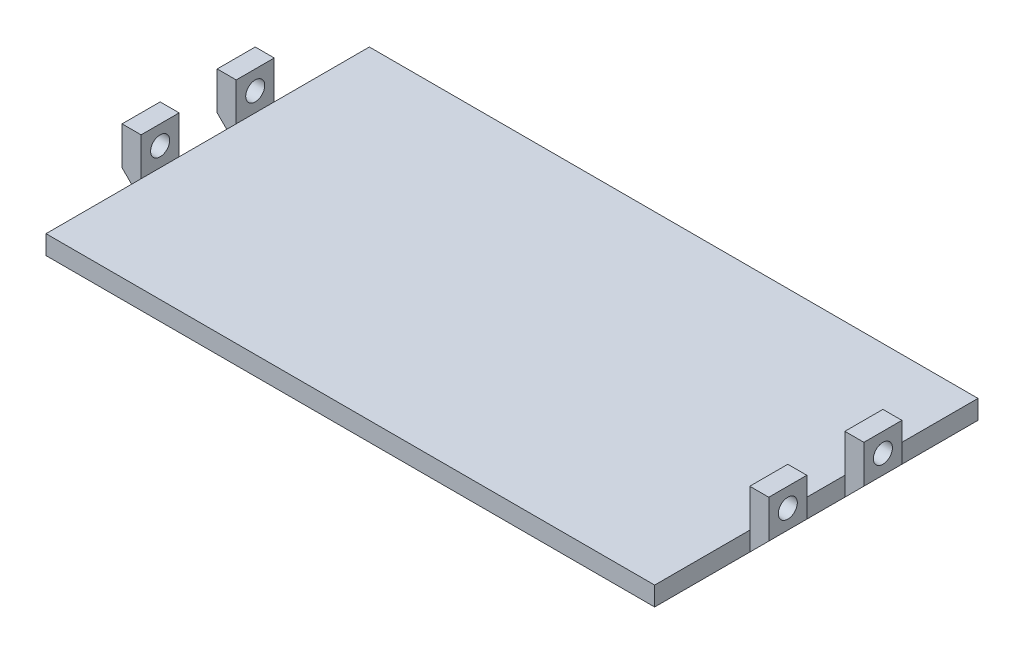
ISO-10303-21;
HEADER;
FILE_DESCRIPTION(('STEP AP214'),'2;1');
FILE_NAME('part.step','',(''),(''),'','','');
FILE_SCHEMA(('AUTOMOTIVE_DESIGN { 1 0 10303 214 1 1 1 1 }'));
ENDSEC;
DATA;
#1=APPLICATION_CONTEXT('core data for automotive mechanical design processes');
#2=APPLICATION_PROTOCOL_DEFINITION('international standard','automotive_design',2000,#1);
#3=PRODUCT_CONTEXT('',#1,'mechanical');
#4=PRODUCT('Part','Part','',(#3));
#5=PRODUCT_RELATED_PRODUCT_CATEGORY('part','',(#4));
#6=PRODUCT_DEFINITION_FORMATION('','',#4);
#7=PRODUCT_DEFINITION_CONTEXT('part definition',#1,'design');
#8=PRODUCT_DEFINITION('design','',#6,#7);
#9=PRODUCT_DEFINITION_SHAPE('','',#8);
#10=(LENGTH_UNIT() NAMED_UNIT(*) SI_UNIT(.MILLI.,.METRE.));
#11=(NAMED_UNIT(*) PLANE_ANGLE_UNIT() SI_UNIT($,.RADIAN.));
#12=(NAMED_UNIT(*) SI_UNIT($,.STERADIAN.) SOLID_ANGLE_UNIT());
#13=UNCERTAINTY_MEASURE_WITH_UNIT(LENGTH_MEASURE(1.E-05),#10,'distance_accuracy_value','');
#14=(GEOMETRIC_REPRESENTATION_CONTEXT(3) GLOBAL_UNCERTAINTY_ASSIGNED_CONTEXT((#13)) GLOBAL_UNIT_ASSIGNED_CONTEXT((#10,
#11,#12)) REPRESENTATION_CONTEXT('',''));
#15=CARTESIAN_POINT('',(0.,0.,0.));
#16=DIRECTION('',(0.,0.,1.));
#17=DIRECTION('',(1.,0.,0.));
#18=AXIS2_PLACEMENT_3D('',#15,#16,#17);
#19=CARTESIAN_POINT('',(85.,5.,-42.5));
#20=DIRECTION('',(-1.,0.,0.));
#21=DIRECTION('',(0.,0.,1.));
#22=AXIS2_PLACEMENT_3D('',#19,#20,#21);
#23=PLANE('',#22);
#24=CARTESIAN_POINT('',(85.,10.,-12.5));
#25=DIRECTION('',(-1.,0.,0.));
#26=DIRECTION('',(0.,0.,1.));
#27=AXIS2_PLACEMENT_3D('',#24,#25,#26);
#28=CIRCLE('',#27,2.5);
#29=CARTESIAN_POINT('',(85.,10.,-10.));
#30=VERTEX_POINT('',#29);
#31=EDGE_CURVE('E360',#30,#30,#28,.T.);
#32=ORIENTED_EDGE('',*,*,#31,.T.);
#33=EDGE_LOOP('',(#32));
#34=FACE_BOUND('',#33,.T.);
#35=DIRECTION('',(0.,-1.,0.));
#36=VECTOR('',#35,1.);
#37=CARTESIAN_POINT('',(85.,15.,-7.50000000000001));
#38=LINE('',#37,#36);
#39=CARTESIAN_POINT('',(85.,15.,-7.50000000000001));
#40=VERTEX_POINT('',#39);
#41=CARTESIAN_POINT('',(85.,4.99999999999998,-7.50000000000001));
#42=VERTEX_POINT('',#41);
#43=EDGE_CURVE('E503',#40,#42,#38,.T.);
#44=ORIENTED_EDGE('',*,*,#43,.T.);
#45=DIRECTION('',(0.,0.,-1.));
#46=VECTOR('',#45,1.);
#47=CARTESIAN_POINT('',(85.,4.99999999999998,-42.5));
#48=LINE('',#47,#46);
#49=CARTESIAN_POINT('',(85.,4.99999999999998,-17.5));
#50=VERTEX_POINT('',#49);
#51=EDGE_CURVE('E387',#42,#50,#48,.T.);
#52=ORIENTED_EDGE('',*,*,#51,.T.);
#53=DIRECTION('',(0.,-1.,0.));
#54=VECTOR('',#53,1.);
#55=CARTESIAN_POINT('',(85.,15.,-17.5));
#56=LINE('',#55,#54);
#57=CARTESIAN_POINT('',(85.,15.,-17.5));
#58=VERTEX_POINT('',#57);
#59=EDGE_CURVE('E507',#58,#50,#56,.T.);
#60=ORIENTED_EDGE('',*,*,#59,.F.);
#61=DIRECTION('',(0.,0.,-1.));
#62=VECTOR('',#61,1.);
#63=CARTESIAN_POINT('',(85.,15.,-17.5));
#64=LINE('',#63,#62);
#65=EDGE_CURVE('E511',#40,#58,#64,.T.);
#66=ORIENTED_EDGE('',*,*,#65,.F.);
#67=EDGE_LOOP('',(#44,#52,#60,#66));
#68=FACE_BOUND('',#67,.T.);
#69=ADVANCED_FACE('F46',(#34,#68),#23,.F.);
#70=CARTESIAN_POINT('',(-85.,5.,-42.5));
#71=DIRECTION('',(1.,0.,0.));
#72=DIRECTION('',(0.,0.,-1.));
#73=AXIS2_PLACEMENT_3D('',#70,#71,#72);
#74=PLANE('',#73);
#75=CARTESIAN_POINT('',(-85.,10.,-12.5));
#76=DIRECTION('',(-1.,0.,0.));
#77=DIRECTION('',(0.,0.,1.));
#78=AXIS2_PLACEMENT_3D('',#75,#76,#77);
#79=CIRCLE('',#78,2.5);
#80=CARTESIAN_POINT('',(-85.,10.,-10.));
#81=VERTEX_POINT('',#80);
#82=EDGE_CURVE('E478',#81,#81,#79,.T.);
#83=ORIENTED_EDGE('',*,*,#82,.F.);
#84=EDGE_LOOP('',(#83));
#85=FACE_BOUND('',#84,.T.);
#86=DIRECTION('',(0.,-1.,0.));
#87=VECTOR('',#86,1.);
#88=CARTESIAN_POINT('',(-85.,15.,-17.5));
#89=LINE('',#88,#87);
#90=CARTESIAN_POINT('',(-85.,15.,-17.5));
#91=VERTEX_POINT('',#90);
#92=CARTESIAN_POINT('',(-85.,4.99999999999998,-17.5));
#93=VERTEX_POINT('',#92);
#94=EDGE_CURVE('E322',#91,#93,#89,.T.);
#95=ORIENTED_EDGE('',*,*,#94,.T.);
#96=DIRECTION('',(0.,0.,1.));
#97=VECTOR('',#96,1.);
#98=CARTESIAN_POINT('',(-85.,4.99999999999998,-42.5));
#99=LINE('',#98,#97);
#100=CARTESIAN_POINT('',(-85.,4.99999999999998,-7.49999999999999));
#101=VERTEX_POINT('',#100);
#102=EDGE_CURVE('E407',#93,#101,#99,.T.);
#103=ORIENTED_EDGE('',*,*,#102,.T.);
#104=DIRECTION('',(0.,-1.,0.));
#105=VECTOR('',#104,1.);
#106=CARTESIAN_POINT('',(-85.,15.,-7.49999999999999));
#107=LINE('',#106,#105);
#108=CARTESIAN_POINT('',(-85.,15.,-7.49999999999999));
#109=VERTEX_POINT('',#108);
#110=EDGE_CURVE('E336',#109,#101,#107,.T.);
#111=ORIENTED_EDGE('',*,*,#110,.F.);
#112=DIRECTION('',(0.,0.,1.));
#113=VECTOR('',#112,1.);
#114=CARTESIAN_POINT('',(-85.,15.,-17.5));
#115=LINE('',#114,#113);
#116=EDGE_CURVE('E309',#91,#109,#115,.T.);
#117=ORIENTED_EDGE('',*,*,#116,.F.);
#118=EDGE_LOOP('',(#95,#103,#111,#117));
#119=FACE_BOUND('',#118,.T.);
#120=ADVANCED_FACE('F440',(#85,#119),#74,.F.);
#121=CARTESIAN_POINT('',(0.,5.,0.));
#122=DIRECTION('',(0.,1.,0.));
#123=DIRECTION('',(0.,0.,1.));
#124=AXIS2_PLACEMENT_3D('',#121,#122,#123);
#125=PLANE('',#124);
#126=DIRECTION('',(0.,0.,-1.));
#127=VECTOR('',#126,1.);
#128=CARTESIAN_POINT('',(-80.,5.,17.5));
#129=LINE('',#128,#127);
#130=CARTESIAN_POINT('',(-80.,5.,42.5));
#131=VERTEX_POINT('',#130);
#132=CARTESIAN_POINT('',(-80.,5.,17.5));
#133=VERTEX_POINT('',#132);
#134=EDGE_CURVE('E459',#131,#133,#129,.T.);
#135=ORIENTED_EDGE('',*,*,#134,.F.);
#136=DIRECTION('',(1.,0.,0.));
#137=VECTOR('',#136,1.);
#138=CARTESIAN_POINT('',(-85.,5.,42.5));
#139=LINE('',#138,#137);
#140=CARTESIAN_POINT('',(80.,5.,42.5));
#141=VERTEX_POINT('',#140);
#142=EDGE_CURVE('E232',#131,#141,#139,.T.);
#143=ORIENTED_EDGE('',*,*,#142,.T.);
#144=DIRECTION('',(0.,0.,1.));
#145=VECTOR('',#144,1.);
#146=CARTESIAN_POINT('',(80.,5.,17.5));
#147=LINE('',#146,#145);
#148=CARTESIAN_POINT('',(80.,5.,17.5));
#149=VERTEX_POINT('',#148);
#150=EDGE_CURVE('E212',#149,#141,#147,.T.);
#151=ORIENTED_EDGE('',*,*,#150,.F.);
#152=DIRECTION('',(0.,0.,1.));
#153=VECTOR('',#152,1.);
#154=CARTESIAN_POINT('',(80.,5.,7.49999999999999));
#155=LINE('',#154,#153);
#156=CARTESIAN_POINT('',(80.,5.,7.49999999999999));
#157=VERTEX_POINT('',#156);
#158=EDGE_CURVE('E229',#157,#149,#155,.T.);
#159=ORIENTED_EDGE('',*,*,#158,.F.);
#160=DIRECTION('',(0.,0.,1.));
#161=VECTOR('',#160,1.);
#162=CARTESIAN_POINT('',(80.,5.,-7.50000000000001));
#163=LINE('',#162,#161);
#164=CARTESIAN_POINT('',(80.,5.,-7.50000000000001));
#165=VERTEX_POINT('',#164);
#166=EDGE_CURVE('E428',#165,#157,#163,.T.);
#167=ORIENTED_EDGE('',*,*,#166,.F.);
#168=DIRECTION('',(0.,0.,1.));
#169=VECTOR('',#168,1.);
#170=CARTESIAN_POINT('',(80.,5.,-17.5));
#171=LINE('',#170,#169);
#172=CARTESIAN_POINT('',(80.,5.,-17.5));
#173=VERTEX_POINT('',#172);
#174=EDGE_CURVE('E258',#173,#165,#171,.T.);
#175=ORIENTED_EDGE('',*,*,#174,.F.);
#176=DIRECTION('',(0.,0.,1.));
#177=VECTOR('',#176,1.);
#178=CARTESIAN_POINT('',(80.,5.,-42.5));
#179=LINE('',#178,#177);
#180=CARTESIAN_POINT('',(80.,5.,-42.5));
#181=VERTEX_POINT('',#180);
#182=EDGE_CURVE('E554',#181,#173,#179,.T.);
#183=ORIENTED_EDGE('',*,*,#182,.F.);
#184=DIRECTION('',(-1.,0.,0.));
#185=VECTOR('',#184,1.);
#186=CARTESIAN_POINT('',(-85.,5.,-42.5));
#187=LINE('',#186,#185);
#188=CARTESIAN_POINT('',(-80.,5.,-42.5));
#189=VERTEX_POINT('',#188);
#190=EDGE_CURVE('E341',#181,#189,#187,.T.);
#191=ORIENTED_EDGE('',*,*,#190,.T.);
#192=DIRECTION('',(0.,0.,-1.));
#193=VECTOR('',#192,1.);
#194=CARTESIAN_POINT('',(-80.,5.,-42.5));
#195=LINE('',#194,#193);
#196=CARTESIAN_POINT('',(-80.,5.,-17.5));
#197=VERTEX_POINT('',#196);
#198=EDGE_CURVE('E452',#197,#189,#195,.T.);
#199=ORIENTED_EDGE('',*,*,#198,.F.);
#200=DIRECTION('',(0.,0.,-1.));
#201=VECTOR('',#200,1.);
#202=CARTESIAN_POINT('',(-80.,5.,-17.5));
#203=LINE('',#202,#201);
#204=CARTESIAN_POINT('',(-80.,5.,-7.49999999999999));
#205=VERTEX_POINT('',#204);
#206=EDGE_CURVE('E296',#205,#197,#203,.T.);
#207=ORIENTED_EDGE('',*,*,#206,.F.);
#208=DIRECTION('',(0.,0.,-1.));
#209=VECTOR('',#208,1.);
#210=CARTESIAN_POINT('',(-80.,5.,-7.49999999999999));
#211=LINE('',#210,#209);
#212=CARTESIAN_POINT('',(-80.,5.,7.50000000000001));
#213=VERTEX_POINT('',#212);
#214=EDGE_CURVE('E424',#213,#205,#211,.T.);
#215=ORIENTED_EDGE('',*,*,#214,.F.);
#216=DIRECTION('',(0.,0.,-1.));
#217=VECTOR('',#216,1.);
#218=CARTESIAN_POINT('',(-80.,5.,7.50000000000001));
#219=LINE('',#218,#217);
#220=EDGE_CURVE('E292',#133,#213,#219,.T.);
#221=ORIENTED_EDGE('',*,*,#220,.F.);
#222=EDGE_LOOP('',(#135,#143,#151,#159,#167,#175,#183,#191,#199,#207,#215,#221));
#223=FACE_BOUND('',#222,.T.);
#224=ADVANCED_FACE('F227',(#223),#125,.T.);
#225=CARTESIAN_POINT('',(85.,10.,12.5));
#226=DIRECTION('',(-1.,0.,0.));
#227=DIRECTION('',(0.,0.,1.));
#228=AXIS2_PLACEMENT_3D('',#225,#226,#227);
#229=CIRCLE('',#228,2.5);
#230=CARTESIAN_POINT('',(85.,10.,15.));
#231=VERTEX_POINT('',#230);
#232=EDGE_CURVE('E472',#231,#231,#229,.T.);
#233=ORIENTED_EDGE('',*,*,#232,.T.);
#234=EDGE_LOOP('',(#233));
#235=FACE_BOUND('',#234,.T.);
#236=DIRECTION('',(0.,-1.,0.));
#237=VECTOR('',#236,1.);
#238=CARTESIAN_POINT('',(85.,15.,17.5));
#239=LINE('',#238,#237);
#240=CARTESIAN_POINT('',(85.,15.,17.5));
#241=VERTEX_POINT('',#240);
#242=CARTESIAN_POINT('',(85.,5.00000000000003,17.5));
#243=VERTEX_POINT('',#242);
#244=EDGE_CURVE('E251',#241,#243,#239,.T.);
#245=ORIENTED_EDGE('',*,*,#244,.T.);
#246=DIRECTION('',(0.,0.,-1.));
#247=VECTOR('',#246,1.);
#248=CARTESIAN_POINT('',(85.,5.00000000000003,-42.5));
#249=LINE('',#248,#247);
#250=CARTESIAN_POINT('',(85.,5.00000000000003,7.49999999999999));
#251=VERTEX_POINT('',#250);
#252=EDGE_CURVE('E348',#243,#251,#249,.T.);
#253=ORIENTED_EDGE('',*,*,#252,.T.);
#254=DIRECTION('',(0.,-1.,0.));
#255=VECTOR('',#254,1.);
#256=CARTESIAN_POINT('',(85.,15.,7.49999999999999));
#257=LINE('',#256,#255);
#258=CARTESIAN_POINT('',(85.,15.,7.49999999999999));
#259=VERTEX_POINT('',#258);
#260=EDGE_CURVE('E256',#259,#251,#257,.T.);
#261=ORIENTED_EDGE('',*,*,#260,.F.);
#262=DIRECTION('',(0.,0.,-1.));
#263=VECTOR('',#262,1.);
#264=CARTESIAN_POINT('',(85.,15.,7.49999999999999));
#265=LINE('',#264,#263);
#266=EDGE_CURVE('E264',#241,#259,#265,.T.);
#267=ORIENTED_EDGE('',*,*,#266,.F.);
#268=EDGE_LOOP('',(#245,#253,#261,#267));
#269=FACE_BOUND('',#268,.T.);
#270=ADVANCED_FACE('F577',(#235,#269),#23,.F.);
#271=CARTESIAN_POINT('',(-85.,5.,-42.5));
#272=DIRECTION('',(0.,0.,1.));
#273=DIRECTION('',(1.,0.,0.));
#274=AXIS2_PLACEMENT_3D('',#271,#272,#273);
#275=PLANE('',#274);
#276=ORIENTED_EDGE('',*,*,#190,.F.);
#277=DIRECTION('',(0.,1.,0.));
#278=VECTOR('',#277,1.);
#279=CARTESIAN_POINT('',(80.,0.,-42.5));
#280=LINE('',#279,#278);
#281=CARTESIAN_POINT('',(80.,0.,-42.5));
#282=VERTEX_POINT('',#281);
#283=EDGE_CURVE('E556',#282,#181,#280,.T.);
#284=ORIENTED_EDGE('',*,*,#283,.F.);
#285=DIRECTION('',(-1.,0.,0.));
#286=VECTOR('',#285,1.);
#287=CARTESIAN_POINT('',(-85.,0.,-42.5));
#288=LINE('',#287,#286);
#289=CARTESIAN_POINT('',(-80.,0.,-42.5));
#290=VERTEX_POINT('',#289);
#291=EDGE_CURVE('E340',#282,#290,#288,.T.);
#292=ORIENTED_EDGE('',*,*,#291,.T.);
#293=DIRECTION('',(0.,1.,0.));
#294=VECTOR('',#293,1.);
#295=CARTESIAN_POINT('',(-80.,0.,-42.5));
#296=LINE('',#295,#294);
#297=EDGE_CURVE('E469',#290,#189,#296,.T.);
#298=ORIENTED_EDGE('',*,*,#297,.T.);
#299=EDGE_LOOP('',(#276,#284,#292,#298));
#300=FACE_BOUND('',#299,.T.);
#301=ADVANCED_FACE('F587',(#300),#275,.F.);
#302=CARTESIAN_POINT('',(-85.,10.,12.5));
#303=DIRECTION('',(-1.,0.,0.));
#304=DIRECTION('',(0.,0.,1.));
#305=AXIS2_PLACEMENT_3D('',#302,#303,#304);
#306=CIRCLE('',#305,2.5);
#307=CARTESIAN_POINT('',(-85.,10.,15.));
#308=VERTEX_POINT('',#307);
#309=EDGE_CURVE('E482',#308,#308,#306,.T.);
#310=ORIENTED_EDGE('',*,*,#309,.F.);
#311=EDGE_LOOP('',(#310));
#312=FACE_BOUND('',#311,.T.);
#313=DIRECTION('',(0.,-1.,0.));
#314=VECTOR('',#313,1.);
#315=CARTESIAN_POINT('',(-85.,15.,7.50000000000001));
#316=LINE('',#315,#314);
#317=CARTESIAN_POINT('',(-85.,15.,7.50000000000001));
#318=VERTEX_POINT('',#317);
#319=CARTESIAN_POINT('',(-85.,4.99999999999998,7.50000000000001));
#320=VERTEX_POINT('',#319);
#321=EDGE_CURVE('E287',#318,#320,#316,.T.);
#322=ORIENTED_EDGE('',*,*,#321,.T.);
#323=DIRECTION('',(0.,0.,1.));
#324=VECTOR('',#323,1.);
#325=CARTESIAN_POINT('',(-85.,4.99999999999998,-42.5));
#326=LINE('',#325,#324);
#327=CARTESIAN_POINT('',(-85.,4.99999999999998,17.5));
#328=VERTEX_POINT('',#327);
#329=EDGE_CURVE('E397',#320,#328,#326,.T.);
#330=ORIENTED_EDGE('',*,*,#329,.T.);
#331=DIRECTION('',(0.,-1.,0.));
#332=VECTOR('',#331,1.);
#333=CARTESIAN_POINT('',(-85.,15.,17.5));
#334=LINE('',#333,#332);
#335=CARTESIAN_POINT('',(-85.,15.,17.5));
#336=VERTEX_POINT('',#335);
#337=EDGE_CURVE('E244',#336,#328,#334,.T.);
#338=ORIENTED_EDGE('',*,*,#337,.F.);
#339=DIRECTION('',(0.,0.,1.));
#340=VECTOR('',#339,1.);
#341=CARTESIAN_POINT('',(-85.,15.,7.50000000000001));
#342=LINE('',#341,#340);
#343=EDGE_CURVE('E297',#318,#336,#342,.T.);
#344=ORIENTED_EDGE('',*,*,#343,.F.);
#345=EDGE_LOOP('',(#322,#330,#338,#344));
#346=FACE_BOUND('',#345,.T.);
#347=ADVANCED_FACE('F584',(#312,#346),#74,.F.);
#348=CARTESIAN_POINT('',(-85.,5.,42.5));
#349=DIRECTION('',(0.,0.,-1.));
#350=DIRECTION('',(-1.,0.,0.));
#351=AXIS2_PLACEMENT_3D('',#348,#349,#350);
#352=PLANE('',#351);
#353=ORIENTED_EDGE('',*,*,#142,.F.);
#354=DIRECTION('',(0.,1.,0.));
#355=VECTOR('',#354,1.);
#356=CARTESIAN_POINT('',(-80.,0.,42.5));
#357=LINE('',#356,#355);
#358=CARTESIAN_POINT('',(-80.,0.,42.5));
#359=VERTEX_POINT('',#358);
#360=EDGE_CURVE('E632',#359,#131,#357,.T.);
#361=ORIENTED_EDGE('',*,*,#360,.F.);
#362=DIRECTION('',(1.,0.,0.));
#363=VECTOR('',#362,1.);
#364=CARTESIAN_POINT('',(-85.,0.,42.5));
#365=LINE('',#364,#363);
#366=CARTESIAN_POINT('',(80.,0.,42.5));
#367=VERTEX_POINT('',#366);
#368=EDGE_CURVE('E345',#359,#367,#365,.T.);
#369=ORIENTED_EDGE('',*,*,#368,.T.);
#370=DIRECTION('',(0.,1.,0.));
#371=VECTOR('',#370,1.);
#372=CARTESIAN_POINT('',(80.,0.,42.5));
#373=LINE('',#372,#371);
#374=EDGE_CURVE('E220',#367,#141,#373,.T.);
#375=ORIENTED_EDGE('',*,*,#374,.T.);
#376=EDGE_LOOP('',(#353,#361,#369,#375));
#377=FACE_BOUND('',#376,.T.);
#378=ADVANCED_FACE('F643',(#377),#352,.F.);
#379=CARTESIAN_POINT('',(0.,0.,0.));
#380=DIRECTION('',(0.,1.,0.));
#381=DIRECTION('',(0.,0.,1.));
#382=AXIS2_PLACEMENT_3D('',#379,#380,#381);
#383=PLANE('',#382);
#384=DIRECTION('',(0.,0.,1.));
#385=VECTOR('',#384,1.);
#386=CARTESIAN_POINT('',(80.,0.,-7.50000000000001));
#387=LINE('',#386,#385);
#388=CARTESIAN_POINT('',(80.,0.,-7.50000000000001));
#389=VERTEX_POINT('',#388);
#390=CARTESIAN_POINT('',(80.,0.,7.49999999999999));
#391=VERTEX_POINT('',#390);
#392=EDGE_CURVE('E611',#389,#391,#387,.T.);
#393=ORIENTED_EDGE('',*,*,#392,.T.);
#394=DIRECTION('',(0.,0.,1.));
#395=VECTOR('',#394,1.);
#396=CARTESIAN_POINT('',(80.,0.,0.));
#397=LINE('',#396,#395);
#398=CARTESIAN_POINT('',(80.,0.,17.5));
#399=VERTEX_POINT('',#398);
#400=EDGE_CURVE('E381',#391,#399,#397,.T.);
#401=ORIENTED_EDGE('',*,*,#400,.T.);
#402=DIRECTION('',(0.,0.,1.));
#403=VECTOR('',#402,1.);
#404=CARTESIAN_POINT('',(80.,0.,17.5));
#405=LINE('',#404,#403);
#406=EDGE_CURVE('E215',#399,#367,#405,.T.);
#407=ORIENTED_EDGE('',*,*,#406,.T.);
#408=ORIENTED_EDGE('',*,*,#368,.F.);
#409=DIRECTION('',(0.,0.,-1.));
#410=VECTOR('',#409,1.);
#411=CARTESIAN_POINT('',(-80.,0.,17.5));
#412=LINE('',#411,#410);
#413=CARTESIAN_POINT('',(-80.,0.,17.5));
#414=VERTEX_POINT('',#413);
#415=EDGE_CURVE('E465',#359,#414,#412,.T.);
#416=ORIENTED_EDGE('',*,*,#415,.T.);
#417=DIRECTION('',(0.,0.,-1.));
#418=VECTOR('',#417,1.);
#419=CARTESIAN_POINT('',(-80.,0.,0.));
#420=LINE('',#419,#418);
#421=CARTESIAN_POINT('',(-80.,0.,7.50000000000001));
#422=VERTEX_POINT('',#421);
#423=EDGE_CURVE('E375',#414,#422,#420,.T.);
#424=ORIENTED_EDGE('',*,*,#423,.T.);
#425=DIRECTION('',(0.,0.,-1.));
#426=VECTOR('',#425,1.);
#427=CARTESIAN_POINT('',(-80.,0.,-7.49999999999999));
#428=LINE('',#427,#426);
#429=CARTESIAN_POINT('',(-80.,0.,-7.49999999999999));
#430=VERTEX_POINT('',#429);
#431=EDGE_CURVE('E421',#422,#430,#428,.T.);
#432=ORIENTED_EDGE('',*,*,#431,.T.);
#433=DIRECTION('',(0.,0.,-1.));
#434=VECTOR('',#433,1.);
#435=CARTESIAN_POINT('',(-80.,0.,0.));
#436=LINE('',#435,#434);
#437=CARTESIAN_POINT('',(-80.,0.,-17.5));
#438=VERTEX_POINT('',#437);
#439=EDGE_CURVE('E372',#430,#438,#436,.T.);
#440=ORIENTED_EDGE('',*,*,#439,.T.);
#441=DIRECTION('',(0.,0.,-1.));
#442=VECTOR('',#441,1.);
#443=CARTESIAN_POINT('',(-80.,0.,-42.5));
#444=LINE('',#443,#442);
#445=EDGE_CURVE('E458',#438,#290,#444,.T.);
#446=ORIENTED_EDGE('',*,*,#445,.T.);
#447=ORIENTED_EDGE('',*,*,#291,.F.);
#448=DIRECTION('',(0.,0.,1.));
#449=VECTOR('',#448,1.);
#450=CARTESIAN_POINT('',(80.,0.,-42.5));
#451=LINE('',#450,#449);
#452=CARTESIAN_POINT('',(80.,0.,-17.5));
#453=VERTEX_POINT('',#452);
#454=EDGE_CURVE('E552',#282,#453,#451,.T.);
#455=ORIENTED_EDGE('',*,*,#454,.T.);
#456=DIRECTION('',(0.,0.,1.));
#457=VECTOR('',#456,1.);
#458=CARTESIAN_POINT('',(80.,0.,0.));
#459=LINE('',#458,#457);
#460=EDGE_CURVE('E378',#453,#389,#459,.T.);
#461=ORIENTED_EDGE('',*,*,#460,.T.);
#462=EDGE_LOOP('',(#393,#401,#407,#408,#416,#424,#432,#440,#446,#447,#455,#461));
#463=FACE_BOUND('',#462,.T.);
#464=ADVANCED_FACE('F432',(#463),#383,.F.);
#465=CARTESIAN_POINT('',(-85.,15.,-7.49999999999999));
#466=DIRECTION('',(0.,0.,-1.));
#467=DIRECTION('',(-1.,0.,0.));
#468=AXIS2_PLACEMENT_3D('',#465,#466,#467);
#469=PLANE('',#468);
#470=ORIENTED_EDGE('',*,*,#110,.T.);
#471=DIRECTION('',(-0.707106781186549,0.707106781186546,0.));
#472=VECTOR('',#471,1.);
#473=CARTESIAN_POINT('',(-85.,4.99999999999998,-7.49999999999999));
#474=LINE('',#473,#472);
#475=EDGE_CURVE('E56',#101,#430,#474,.F.);
#476=ORIENTED_EDGE('',*,*,#475,.T.);
#477=DIRECTION('',(0.,1.,0.));
#478=VECTOR('',#477,1.);
#479=CARTESIAN_POINT('',(-80.,0.,-7.49999999999999));
#480=LINE('',#479,#478);
#481=EDGE_CURVE('E414',#430,#205,#480,.T.);
#482=ORIENTED_EDGE('',*,*,#481,.T.);
#483=DIRECTION('',(0.,-1.,0.));
#484=VECTOR('',#483,1.);
#485=CARTESIAN_POINT('',(-80.,15.,-7.49999999999999));
#486=LINE('',#485,#484);
#487=CARTESIAN_POINT('',(-80.,15.,-7.49999999999999));
#488=VERTEX_POINT('',#487);
#489=EDGE_CURVE('E332',#488,#205,#486,.T.);
#490=ORIENTED_EDGE('',*,*,#489,.F.);
#491=DIRECTION('',(1.,0.,0.));
#492=VECTOR('',#491,1.);
#493=CARTESIAN_POINT('',(-85.,15.,-7.49999999999999));
#494=LINE('',#493,#492);
#495=EDGE_CURVE('E313',#109,#488,#494,.T.);
#496=ORIENTED_EDGE('',*,*,#495,.F.);
#497=EDGE_LOOP('',(#470,#476,#482,#490,#496));
#498=FACE_BOUND('',#497,.T.);
#499=ADVANCED_FACE('F412',(#498),#469,.F.);
#500=CARTESIAN_POINT('',(-80.,15.,-17.5));
#501=DIRECTION('',(-1.,0.,0.));
#502=DIRECTION('',(0.,0.,1.));
#503=AXIS2_PLACEMENT_3D('',#500,#501,#502);
#504=PLANE('',#503);
#505=CARTESIAN_POINT('',(-80.,10.,-12.5));
#506=DIRECTION('',(-1.,0.,0.));
#507=DIRECTION('',(0.,0.,1.));
#508=AXIS2_PLACEMENT_3D('',#505,#506,#507);
#509=CIRCLE('',#508,2.5);
#510=CARTESIAN_POINT('',(-80.,10.,-10.));
#511=VERTEX_POINT('',#510);
#512=EDGE_CURVE('E359',#511,#511,#509,.T.);
#513=ORIENTED_EDGE('',*,*,#512,.T.);
#514=EDGE_LOOP('',(#513));
#515=FACE_BOUND('',#514,.T.);
#516=ORIENTED_EDGE('',*,*,#206,.T.);
#517=DIRECTION('',(0.,-1.,0.));
#518=VECTOR('',#517,1.);
#519=CARTESIAN_POINT('',(-80.,15.,-17.5));
#520=LINE('',#519,#518);
#521=CARTESIAN_POINT('',(-80.,15.,-17.5));
#522=VERTEX_POINT('',#521);
#523=EDGE_CURVE('E328',#522,#197,#520,.T.);
#524=ORIENTED_EDGE('',*,*,#523,.F.);
#525=DIRECTION('',(0.,0.,-1.));
#526=VECTOR('',#525,1.);
#527=CARTESIAN_POINT('',(-80.,15.,-17.5));
#528=LINE('',#527,#526);
#529=EDGE_CURVE('E316',#488,#522,#528,.T.);
#530=ORIENTED_EDGE('',*,*,#529,.F.);
#531=ORIENTED_EDGE('',*,*,#489,.T.);
#532=EDGE_LOOP('',(#516,#524,#530,#531));
#533=FACE_BOUND('',#532,.T.);
#534=ADVANCED_FACE('F449',(#515,#533),#504,.F.);
#535=CARTESIAN_POINT('',(-85.,15.,-17.5));
#536=DIRECTION('',(0.,0.,1.));
#537=DIRECTION('',(1.,0.,0.));
#538=AXIS2_PLACEMENT_3D('',#535,#536,#537);
#539=PLANE('',#538);
#540=DIRECTION('',(0.,1.,0.));
#541=VECTOR('',#540,1.);
#542=CARTESIAN_POINT('',(-80.,0.,-17.5));
#543=LINE('',#542,#541);
#544=EDGE_CURVE('E463',#438,#197,#543,.T.);
#545=ORIENTED_EDGE('',*,*,#544,.F.);
#546=DIRECTION('',(0.707106781186549,-0.707106781186546,0.));
#547=VECTOR('',#546,1.);
#548=CARTESIAN_POINT('',(-85.,4.99999999999998,-17.5));
#549=LINE('',#548,#547);
#550=EDGE_CURVE('E11',#438,#93,#549,.F.);
#551=ORIENTED_EDGE('',*,*,#550,.T.);
#552=ORIENTED_EDGE('',*,*,#94,.F.);
#553=DIRECTION('',(-1.,0.,0.));
#554=VECTOR('',#553,1.);
#555=CARTESIAN_POINT('',(-85.,15.,-17.5));
#556=LINE('',#555,#554);
#557=EDGE_CURVE('E319',#522,#91,#556,.T.);
#558=ORIENTED_EDGE('',*,*,#557,.F.);
#559=ORIENTED_EDGE('',*,*,#523,.T.);
#560=EDGE_LOOP('',(#545,#551,#552,#558,#559));
#561=FACE_BOUND('',#560,.T.);
#562=ADVANCED_FACE('F443',(#561),#539,.F.);
#563=CARTESIAN_POINT('',(0.,15.,0.));
#564=DIRECTION('',(0.,1.,0.));
#565=DIRECTION('',(0.,0.,1.));
#566=AXIS2_PLACEMENT_3D('',#563,#564,#565);
#567=PLANE('',#566);
#568=ORIENTED_EDGE('',*,*,#116,.T.);
#569=ORIENTED_EDGE('',*,*,#495,.T.);
#570=ORIENTED_EDGE('',*,*,#529,.T.);
#571=ORIENTED_EDGE('',*,*,#557,.T.);
#572=EDGE_LOOP('',(#568,#569,#570,#571));
#573=FACE_BOUND('',#572,.T.);
#574=ADVANCED_FACE('F446',(#573),#567,.T.);
#575=CARTESIAN_POINT('',(-85.,15.,17.5));
#576=DIRECTION('',(0.,0.,-1.));
#577=DIRECTION('',(-1.,0.,0.));
#578=AXIS2_PLACEMENT_3D('',#575,#576,#577);
#579=PLANE('',#578);
#580=ORIENTED_EDGE('',*,*,#337,.T.);
#581=DIRECTION('',(-0.707106781186549,0.707106781186546,0.));
#582=VECTOR('',#581,1.);
#583=CARTESIAN_POINT('',(-85.,4.99999999999998,17.5));
#584=LINE('',#583,#582);
#585=EDGE_CURVE('E401',#328,#414,#584,.F.);
#586=ORIENTED_EDGE('',*,*,#585,.T.);
#587=DIRECTION('',(0.,1.,0.));
#588=VECTOR('',#587,1.);
#589=CARTESIAN_POINT('',(-80.,0.,17.5));
#590=LINE('',#589,#588);
#591=EDGE_CURVE('E627',#414,#133,#590,.T.);
#592=ORIENTED_EDGE('',*,*,#591,.T.);
#593=DIRECTION('',(0.,-1.,0.));
#594=VECTOR('',#593,1.);
#595=CARTESIAN_POINT('',(-80.,15.,17.5));
#596=LINE('',#595,#594);
#597=CARTESIAN_POINT('',(-80.,15.,17.5));
#598=VERTEX_POINT('',#597);
#599=EDGE_CURVE('E279',#598,#133,#596,.T.);
#600=ORIENTED_EDGE('',*,*,#599,.F.);
#601=DIRECTION('',(1.,0.,0.));
#602=VECTOR('',#601,1.);
#603=CARTESIAN_POINT('',(-85.,15.,17.5));
#604=LINE('',#603,#602);
#605=EDGE_CURVE('E303',#336,#598,#604,.T.);
#606=ORIENTED_EDGE('',*,*,#605,.F.);
#607=EDGE_LOOP('',(#580,#586,#592,#600,#606));
#608=FACE_BOUND('',#607,.T.);
#609=ADVANCED_FACE('F665',(#608),#579,.F.);
#610=CARTESIAN_POINT('',(-80.,15.,7.50000000000001));
#611=DIRECTION('',(-1.,0.,0.));
#612=DIRECTION('',(0.,0.,1.));
#613=AXIS2_PLACEMENT_3D('',#610,#611,#612);
#614=PLANE('',#613);
#615=CARTESIAN_POINT('',(-80.,10.,12.5));
#616=DIRECTION('',(-1.,0.,0.));
#617=DIRECTION('',(0.,0.,1.));
#618=AXIS2_PLACEMENT_3D('',#615,#616,#617);
#619=CIRCLE('',#618,2.5);
#620=CARTESIAN_POINT('',(-80.,10.,15.));
#621=VERTEX_POINT('',#620);
#622=EDGE_CURVE('E365',#621,#621,#619,.T.);
#623=ORIENTED_EDGE('',*,*,#622,.T.);
#624=EDGE_LOOP('',(#623));
#625=FACE_BOUND('',#624,.T.);
#626=ORIENTED_EDGE('',*,*,#220,.T.);
#627=DIRECTION('',(0.,-1.,0.));
#628=VECTOR('',#627,1.);
#629=CARTESIAN_POINT('',(-80.,15.,7.50000000000001));
#630=LINE('',#629,#628);
#631=CARTESIAN_POINT('',(-80.,15.,7.50000000000001));
#632=VERTEX_POINT('',#631);
#633=EDGE_CURVE('E283',#632,#213,#630,.T.);
#634=ORIENTED_EDGE('',*,*,#633,.F.);
#635=DIRECTION('',(0.,0.,-1.));
#636=VECTOR('',#635,1.);
#637=CARTESIAN_POINT('',(-80.,15.,7.50000000000001));
#638=LINE('',#637,#636);
#639=EDGE_CURVE('E300',#598,#632,#638,.T.);
#640=ORIENTED_EDGE('',*,*,#639,.F.);
#641=ORIENTED_EDGE('',*,*,#599,.T.);
#642=EDGE_LOOP('',(#626,#634,#640,#641));
#643=FACE_BOUND('',#642,.T.);
#644=ADVANCED_FACE('F662',(#625,#643),#614,.F.);
#645=CARTESIAN_POINT('',(-85.,15.,7.50000000000001));
#646=DIRECTION('',(0.,0.,1.));
#647=DIRECTION('',(1.,0.,0.));
#648=AXIS2_PLACEMENT_3D('',#645,#646,#647);
#649=PLANE('',#648);
#650=DIRECTION('',(0.,1.,0.));
#651=VECTOR('',#650,1.);
#652=CARTESIAN_POINT('',(-80.,0.,7.50000000000001));
#653=LINE('',#652,#651);
#654=EDGE_CURVE('E427',#422,#213,#653,.T.);
#655=ORIENTED_EDGE('',*,*,#654,.F.);
#656=DIRECTION('',(0.707106781186549,-0.707106781186546,0.));
#657=VECTOR('',#656,1.);
#658=CARTESIAN_POINT('',(-85.,4.99999999999998,7.50000000000001));
#659=LINE('',#658,#657);
#660=EDGE_CURVE('E404',#422,#320,#659,.F.);
#661=ORIENTED_EDGE('',*,*,#660,.T.);
#662=ORIENTED_EDGE('',*,*,#321,.F.);
#663=DIRECTION('',(-1.,0.,0.));
#664=VECTOR('',#663,1.);
#665=CARTESIAN_POINT('',(-85.,15.,7.50000000000001));
#666=LINE('',#665,#664);
#667=EDGE_CURVE('E291',#632,#318,#666,.T.);
#668=ORIENTED_EDGE('',*,*,#667,.F.);
#669=ORIENTED_EDGE('',*,*,#633,.T.);
#670=EDGE_LOOP('',(#655,#661,#662,#668,#669));
#671=FACE_BOUND('',#670,.T.);
#672=ADVANCED_FACE('F651',(#671),#649,.F.);
#673=CARTESIAN_POINT('',(0.,15.,0.));
#674=DIRECTION('',(0.,1.,0.));
#675=DIRECTION('',(0.,0.,1.));
#676=AXIS2_PLACEMENT_3D('',#673,#674,#675);
#677=PLANE('',#676);
#678=ORIENTED_EDGE('',*,*,#343,.T.);
#679=ORIENTED_EDGE('',*,*,#605,.T.);
#680=ORIENTED_EDGE('',*,*,#639,.T.);
#681=ORIENTED_EDGE('',*,*,#667,.T.);
#682=EDGE_LOOP('',(#678,#679,#680,#681));
#683=FACE_BOUND('',#682,.T.);
#684=ADVANCED_FACE('F657',(#683),#677,.T.);
#685=CARTESIAN_POINT('',(85.,15.,7.49999999999999));
#686=DIRECTION('',(0.,0.,1.));
#687=DIRECTION('',(1.,0.,0.));
#688=AXIS2_PLACEMENT_3D('',#685,#686,#687);
#689=PLANE('',#688);
#690=ORIENTED_EDGE('',*,*,#260,.T.);
#691=DIRECTION('',(0.707106781186548,0.707106781186548,0.));
#692=VECTOR('',#691,1.);
#693=CARTESIAN_POINT('',(85.,5.00000000000003,7.49999999999999));
#694=LINE('',#693,#692);
#695=EDGE_CURVE('E369',#251,#391,#694,.F.);
#696=ORIENTED_EDGE('',*,*,#695,.T.);
#697=DIRECTION('',(0.,1.,0.));
#698=VECTOR('',#697,1.);
#699=CARTESIAN_POINT('',(80.,0.,7.49999999999999));
#700=LINE('',#699,#698);
#701=EDGE_CURVE('E605',#391,#157,#700,.T.);
#702=ORIENTED_EDGE('',*,*,#701,.T.);
#703=DIRECTION('',(0.,-1.,0.));
#704=VECTOR('',#703,1.);
#705=CARTESIAN_POINT('',(80.,15.,7.49999999999999));
#706=LINE('',#705,#704);
#707=CARTESIAN_POINT('',(80.,15.,7.49999999999999));
#708=VERTEX_POINT('',#707);
#709=EDGE_CURVE('E242',#708,#157,#706,.T.);
#710=ORIENTED_EDGE('',*,*,#709,.F.);
#711=DIRECTION('',(-1.,0.,0.));
#712=VECTOR('',#711,1.);
#713=CARTESIAN_POINT('',(85.,15.,7.49999999999999));
#714=LINE('',#713,#712);
#715=EDGE_CURVE('E245',#259,#708,#714,.T.);
#716=ORIENTED_EDGE('',*,*,#715,.F.);
#717=EDGE_LOOP('',(#690,#696,#702,#710,#716));
#718=FACE_BOUND('',#717,.T.);
#719=ADVANCED_FACE('F604',(#718),#689,.F.);
#720=CARTESIAN_POINT('',(80.,15.,7.49999999999999));
#721=DIRECTION('',(1.,0.,0.));
#722=DIRECTION('',(0.,0.,-1.));
#723=AXIS2_PLACEMENT_3D('',#720,#721,#722);
#724=PLANE('',#723);
#725=CARTESIAN_POINT('',(80.,10.,12.5));
#726=DIRECTION('',(1.,0.,0.));
#727=DIRECTION('',(0.,0.,-1.));
#728=AXIS2_PLACEMENT_3D('',#725,#726,#727);
#729=CIRCLE('',#728,2.5);
#730=CARTESIAN_POINT('',(80.,10.,9.99999999999998));
#731=VERTEX_POINT('',#730);
#732=EDGE_CURVE('E361',#731,#731,#729,.T.);
#733=ORIENTED_EDGE('',*,*,#732,.T.);
#734=EDGE_LOOP('',(#733));
#735=FACE_BOUND('',#734,.T.);
#736=ORIENTED_EDGE('',*,*,#158,.T.);
#737=DIRECTION('',(0.,-1.,0.));
#738=VECTOR('',#737,1.);
#739=CARTESIAN_POINT('',(80.,15.,17.5));
#740=LINE('',#739,#738);
#741=CARTESIAN_POINT('',(80.,15.,17.5));
#742=VERTEX_POINT('',#741);
#743=EDGE_CURVE('E239',#742,#149,#740,.T.);
#744=ORIENTED_EDGE('',*,*,#743,.F.);
#745=DIRECTION('',(0.,0.,1.));
#746=VECTOR('',#745,1.);
#747=CARTESIAN_POINT('',(80.,15.,7.49999999999999));
#748=LINE('',#747,#746);
#749=EDGE_CURVE('E270',#708,#742,#748,.T.);
#750=ORIENTED_EDGE('',*,*,#749,.F.);
#751=ORIENTED_EDGE('',*,*,#709,.T.);
#752=EDGE_LOOP('',(#736,#744,#750,#751));
#753=FACE_BOUND('',#752,.T.);
#754=ADVANCED_FACE('F238',(#735,#753),#724,.F.);
#755=CARTESIAN_POINT('',(85.,15.,17.5));
#756=DIRECTION('',(0.,0.,-1.));
#757=DIRECTION('',(-1.,0.,0.));
#758=AXIS2_PLACEMENT_3D('',#755,#756,#757);
#759=PLANE('',#758);
#760=DIRECTION('',(0.,1.,0.));
#761=VECTOR('',#760,1.);
#762=CARTESIAN_POINT('',(80.,0.,17.5));
#763=LINE('',#762,#761);
#764=EDGE_CURVE('E209',#399,#149,#763,.T.);
#765=ORIENTED_EDGE('',*,*,#764,.F.);
#766=DIRECTION('',(-0.707106781186548,-0.707106781186548,0.));
#767=VECTOR('',#766,1.);
#768=CARTESIAN_POINT('',(85.,5.00000000000002,17.5));
#769=LINE('',#768,#767);
#770=EDGE_CURVE('E384',#399,#243,#769,.F.);
#771=ORIENTED_EDGE('',*,*,#770,.T.);
#772=ORIENTED_EDGE('',*,*,#244,.F.);
#773=DIRECTION('',(1.,0.,0.));
#774=VECTOR('',#773,1.);
#775=CARTESIAN_POINT('',(85.,15.,17.5));
#776=LINE('',#775,#774);
#777=EDGE_CURVE('E249',#742,#241,#776,.T.);
#778=ORIENTED_EDGE('',*,*,#777,.F.);
#779=ORIENTED_EDGE('',*,*,#743,.T.);
#780=EDGE_LOOP('',(#765,#771,#772,#778,#779));
#781=FACE_BOUND('',#780,.T.);
#782=ADVANCED_FACE('F247',(#781),#759,.F.);
#783=CARTESIAN_POINT('',(0.,15.,0.));
#784=DIRECTION('',(0.,1.,0.));
#785=DIRECTION('',(0.,0.,1.));
#786=AXIS2_PLACEMENT_3D('',#783,#784,#785);
#787=PLANE('',#786);
#788=ORIENTED_EDGE('',*,*,#715,.T.);
#789=ORIENTED_EDGE('',*,*,#749,.T.);
#790=ORIENTED_EDGE('',*,*,#777,.T.);
#791=ORIENTED_EDGE('',*,*,#266,.T.);
#792=EDGE_LOOP('',(#788,#789,#790,#791));
#793=FACE_BOUND('',#792,.T.);
#794=ADVANCED_FACE('F678',(#793),#787,.T.);
#795=CARTESIAN_POINT('',(85.,15.,-17.5));
#796=DIRECTION('',(0.,0.,1.));
#797=DIRECTION('',(1.,0.,0.));
#798=AXIS2_PLACEMENT_3D('',#795,#796,#797);
#799=PLANE('',#798);
#800=ORIENTED_EDGE('',*,*,#59,.T.);
#801=DIRECTION('',(0.707106781186549,0.707106781186546,0.));
#802=VECTOR('',#801,1.);
#803=CARTESIAN_POINT('',(85.,4.99999999999997,-17.5));
#804=LINE('',#803,#802);
#805=EDGE_CURVE('E391',#50,#453,#804,.F.);
#806=ORIENTED_EDGE('',*,*,#805,.T.);
#807=DIRECTION('',(0.,1.,0.));
#808=VECTOR('',#807,1.);
#809=CARTESIAN_POINT('',(80.,0.,-17.5));
#810=LINE('',#809,#808);
#811=EDGE_CURVE('E234',#453,#173,#810,.T.);
#812=ORIENTED_EDGE('',*,*,#811,.T.);
#813=DIRECTION('',(0.,-1.,0.));
#814=VECTOR('',#813,1.);
#815=CARTESIAN_POINT('',(80.,15.,-17.5));
#816=LINE('',#815,#814);
#817=CARTESIAN_POINT('',(80.,15.,-17.5));
#818=VERTEX_POINT('',#817);
#819=EDGE_CURVE('E495',#818,#173,#816,.T.);
#820=ORIENTED_EDGE('',*,*,#819,.F.);
#821=DIRECTION('',(-1.,0.,0.));
#822=VECTOR('',#821,1.);
#823=CARTESIAN_POINT('',(85.,15.,-17.5));
#824=LINE('',#823,#822);
#825=EDGE_CURVE('E515',#58,#818,#824,.T.);
#826=ORIENTED_EDGE('',*,*,#825,.F.);
#827=EDGE_LOOP('',(#800,#806,#812,#820,#826));
#828=FACE_BOUND('',#827,.T.);
#829=ADVANCED_FACE('F534',(#828),#799,.F.);
#830=CARTESIAN_POINT('',(80.,15.,-17.5));
#831=DIRECTION('',(1.,0.,0.));
#832=DIRECTION('',(0.,0.,-1.));
#833=AXIS2_PLACEMENT_3D('',#830,#831,#832);
#834=PLANE('',#833);
#835=CARTESIAN_POINT('',(80.,10.,-12.5));
#836=DIRECTION('',(1.,0.,0.));
#837=DIRECTION('',(0.,0.,-1.));
#838=AXIS2_PLACEMENT_3D('',#835,#836,#837);
#839=CIRCLE('',#838,2.5);
#840=CARTESIAN_POINT('',(80.,10.,-15.));
#841=VERTEX_POINT('',#840);
#842=EDGE_CURVE('E355',#841,#841,#839,.T.);
#843=ORIENTED_EDGE('',*,*,#842,.T.);
#844=EDGE_LOOP('',(#843));
#845=FACE_BOUND('',#844,.T.);
#846=ORIENTED_EDGE('',*,*,#174,.T.);
#847=DIRECTION('',(0.,-1.,0.));
#848=VECTOR('',#847,1.);
#849=CARTESIAN_POINT('',(80.,15.,-7.50000000000001));
#850=LINE('',#849,#848);
#851=CARTESIAN_POINT('',(80.,15.,-7.50000000000001));
#852=VERTEX_POINT('',#851);
#853=EDGE_CURVE('E499',#852,#165,#850,.T.);
#854=ORIENTED_EDGE('',*,*,#853,.F.);
#855=DIRECTION('',(0.,0.,1.));
#856=VECTOR('',#855,1.);
#857=CARTESIAN_POINT('',(80.,15.,-17.5));
#858=LINE('',#857,#856);
#859=EDGE_CURVE('E521',#818,#852,#858,.T.);
#860=ORIENTED_EDGE('',*,*,#859,.F.);
#861=ORIENTED_EDGE('',*,*,#819,.T.);
#862=EDGE_LOOP('',(#846,#854,#860,#861));
#863=FACE_BOUND('',#862,.T.);
#864=ADVANCED_FACE('F538',(#845,#863),#834,.F.);
#865=CARTESIAN_POINT('',(85.,15.,-7.50000000000001));
#866=DIRECTION('',(0.,0.,-1.));
#867=DIRECTION('',(-1.,0.,0.));
#868=AXIS2_PLACEMENT_3D('',#865,#866,#867);
#869=PLANE('',#868);
#870=DIRECTION('',(0.,1.,0.));
#871=VECTOR('',#870,1.);
#872=CARTESIAN_POINT('',(80.,0.,-7.50000000000001));
#873=LINE('',#872,#871);
#874=EDGE_CURVE('E613',#389,#165,#873,.T.);
#875=ORIENTED_EDGE('',*,*,#874,.F.);
#876=DIRECTION('',(-0.707106781186549,-0.707106781186546,0.));
#877=VECTOR('',#876,1.);
#878=CARTESIAN_POINT('',(85.,4.99999999999997,-7.50000000000001));
#879=LINE('',#878,#877);
#880=EDGE_CURVE('E394',#389,#42,#879,.F.);
#881=ORIENTED_EDGE('',*,*,#880,.T.);
#882=ORIENTED_EDGE('',*,*,#43,.F.);
#883=DIRECTION('',(1.,0.,0.));
#884=VECTOR('',#883,1.);
#885=CARTESIAN_POINT('',(85.,15.,-7.50000000000001));
#886=LINE('',#885,#884);
#887=EDGE_CURVE('E518',#852,#40,#886,.T.);
#888=ORIENTED_EDGE('',*,*,#887,.F.);
#889=ORIENTED_EDGE('',*,*,#853,.T.);
#890=EDGE_LOOP('',(#875,#881,#882,#888,#889));
#891=FACE_BOUND('',#890,.T.);
#892=ADVANCED_FACE('F543',(#891),#869,.F.);
#893=CARTESIAN_POINT('',(0.,15.,0.));
#894=DIRECTION('',(0.,1.,0.));
#895=DIRECTION('',(0.,0.,1.));
#896=AXIS2_PLACEMENT_3D('',#893,#894,#895);
#897=PLANE('',#896);
#898=ORIENTED_EDGE('',*,*,#825,.T.);
#899=ORIENTED_EDGE('',*,*,#859,.T.);
#900=ORIENTED_EDGE('',*,*,#887,.T.);
#901=ORIENTED_EDGE('',*,*,#65,.T.);
#902=EDGE_LOOP('',(#898,#899,#900,#901));
#903=FACE_BOUND('',#902,.T.);
#904=ADVANCED_FACE('F528',(#903),#897,.T.);
#905=CARTESIAN_POINT('',(85.,10.,-12.5));
#906=DIRECTION('',(-1.,0.,0.));
#907=DIRECTION('',(0.,0.,1.));
#908=AXIS2_PLACEMENT_3D('',#905,#906,#907);
#909=CYLINDRICAL_SURFACE('',#908,2.5);
#910=ORIENTED_EDGE('',*,*,#31,.F.);
#911=EDGE_LOOP('',(#910));
#912=FACE_BOUND('',#911,.T.);
#913=ORIENTED_EDGE('',*,*,#842,.F.);
#914=EDGE_LOOP('',(#913));
#915=FACE_BOUND('',#914,.T.);
#916=ADVANCED_FACE('F711',(#912,#915),#909,.F.);
#917=CARTESIAN_POINT('',(85.,10.,12.5));
#918=DIRECTION('',(-1.,0.,0.));
#919=DIRECTION('',(0.,0.,1.));
#920=AXIS2_PLACEMENT_3D('',#917,#918,#919);
#921=CYLINDRICAL_SURFACE('',#920,2.5);
#922=ORIENTED_EDGE('',*,*,#232,.F.);
#923=EDGE_LOOP('',(#922));
#924=FACE_BOUND('',#923,.T.);
#925=ORIENTED_EDGE('',*,*,#732,.F.);
#926=EDGE_LOOP('',(#925));
#927=FACE_BOUND('',#926,.T.);
#928=ADVANCED_FACE('F702',(#924,#927),#921,.F.);
#929=ORIENTED_EDGE('',*,*,#309,.T.);
#930=EDGE_LOOP('',(#929));
#931=FACE_BOUND('',#930,.T.);
#932=ORIENTED_EDGE('',*,*,#622,.F.);
#933=EDGE_LOOP('',(#932));
#934=FACE_BOUND('',#933,.T.);
#935=ADVANCED_FACE('F698',(#931,#934),#921,.F.);
#936=ORIENTED_EDGE('',*,*,#82,.T.);
#937=EDGE_LOOP('',(#936));
#938=FACE_BOUND('',#937,.T.);
#939=ORIENTED_EDGE('',*,*,#512,.F.);
#940=EDGE_LOOP('',(#939));
#941=FACE_BOUND('',#940,.T.);
#942=ADVANCED_FACE('F701',(#938,#941),#909,.F.);
#943=CARTESIAN_POINT('',(80.,0.,-7.50000000000001));
#944=DIRECTION('',(-1.,0.,0.));
#945=DIRECTION('',(0.,0.,1.));
#946=AXIS2_PLACEMENT_3D('',#943,#944,#945);
#947=PLANE('',#946);
#948=ORIENTED_EDGE('',*,*,#166,.T.);
#949=ORIENTED_EDGE('',*,*,#701,.F.);
#950=ORIENTED_EDGE('',*,*,#392,.F.);
#951=ORIENTED_EDGE('',*,*,#874,.T.);
#952=EDGE_LOOP('',(#948,#949,#950,#951));
#953=FACE_BOUND('',#952,.T.);
#954=ADVANCED_FACE('F610',(#953),#947,.F.);
#955=CARTESIAN_POINT('',(80.,0.,-42.5));
#956=DIRECTION('',(-1.,0.,0.));
#957=DIRECTION('',(0.,0.,1.));
#958=AXIS2_PLACEMENT_3D('',#955,#956,#957);
#959=PLANE('',#958);
#960=ORIENTED_EDGE('',*,*,#182,.T.);
#961=ORIENTED_EDGE('',*,*,#811,.F.);
#962=ORIENTED_EDGE('',*,*,#454,.F.);
#963=ORIENTED_EDGE('',*,*,#283,.T.);
#964=EDGE_LOOP('',(#960,#961,#962,#963));
#965=FACE_BOUND('',#964,.T.);
#966=ADVANCED_FACE('F551',(#965),#959,.F.);
#967=CARTESIAN_POINT('',(80.,0.,17.5));
#968=DIRECTION('',(-1.,0.,0.));
#969=DIRECTION('',(0.,0.,1.));
#970=AXIS2_PLACEMENT_3D('',#967,#968,#969);
#971=PLANE('',#970);
#972=ORIENTED_EDGE('',*,*,#150,.T.);
#973=ORIENTED_EDGE('',*,*,#374,.F.);
#974=ORIENTED_EDGE('',*,*,#406,.F.);
#975=ORIENTED_EDGE('',*,*,#764,.T.);
#976=EDGE_LOOP('',(#972,#973,#974,#975));
#977=FACE_BOUND('',#976,.T.);
#978=ADVANCED_FACE('F211',(#977),#971,.F.);
#979=CARTESIAN_POINT('',(-80.,0.,-7.49999999999999));
#980=DIRECTION('',(1.,0.,0.));
#981=DIRECTION('',(0.,0.,-1.));
#982=AXIS2_PLACEMENT_3D('',#979,#980,#981);
#983=PLANE('',#982);
#984=ORIENTED_EDGE('',*,*,#214,.T.);
#985=ORIENTED_EDGE('',*,*,#481,.F.);
#986=ORIENTED_EDGE('',*,*,#431,.F.);
#987=ORIENTED_EDGE('',*,*,#654,.T.);
#988=EDGE_LOOP('',(#984,#985,#986,#987));
#989=FACE_BOUND('',#988,.T.);
#990=ADVANCED_FACE('F420',(#989),#983,.F.);
#991=CARTESIAN_POINT('',(-80.,0.,17.5));
#992=DIRECTION('',(1.,0.,0.));
#993=DIRECTION('',(0.,0.,-1.));
#994=AXIS2_PLACEMENT_3D('',#991,#992,#993);
#995=PLANE('',#994);
#996=ORIENTED_EDGE('',*,*,#134,.T.);
#997=ORIENTED_EDGE('',*,*,#591,.F.);
#998=ORIENTED_EDGE('',*,*,#415,.F.);
#999=ORIENTED_EDGE('',*,*,#360,.T.);
#1000=EDGE_LOOP('',(#996,#997,#998,#999));
#1001=FACE_BOUND('',#1000,.T.);
#1002=ADVANCED_FACE('F663',(#1001),#995,.F.);
#1003=CARTESIAN_POINT('',(-80.,0.,-42.5));
#1004=DIRECTION('',(1.,0.,0.));
#1005=DIRECTION('',(0.,0.,-1.));
#1006=AXIS2_PLACEMENT_3D('',#1003,#1004,#1005);
#1007=PLANE('',#1006);
#1008=ORIENTED_EDGE('',*,*,#198,.T.);
#1009=ORIENTED_EDGE('',*,*,#297,.F.);
#1010=ORIENTED_EDGE('',*,*,#445,.F.);
#1011=ORIENTED_EDGE('',*,*,#544,.T.);
#1012=EDGE_LOOP('',(#1008,#1009,#1010,#1011));
#1013=FACE_BOUND('',#1012,.T.);
#1014=ADVANCED_FACE('F570',(#1013),#1007,.F.);
#1015=CARTESIAN_POINT('',(85.,5.00000000000003,-42.5));
#1016=DIRECTION('',(-0.707106781186547,0.707106781186547,0.));
#1017=DIRECTION('',(0.,0.,-1.));
#1018=AXIS2_PLACEMENT_3D('',#1015,#1016,#1017);
#1019=PLANE('',#1018);
#1020=ORIENTED_EDGE('',*,*,#770,.F.);
#1021=ORIENTED_EDGE('',*,*,#400,.F.);
#1022=ORIENTED_EDGE('',*,*,#695,.F.);
#1023=ORIENTED_EDGE('',*,*,#252,.F.);
#1024=EDGE_LOOP('',(#1020,#1021,#1022,#1023));
#1025=FACE_BOUND('',#1024,.T.);
#1026=ADVANCED_FACE('F563',(#1025),#1019,.F.);
#1027=CARTESIAN_POINT('',(85.,4.99999999999998,-42.5));
#1028=DIRECTION('',(-0.707106781186546,0.707106781186549,0.));
#1029=DIRECTION('',(0.,0.,-1.));
#1030=AXIS2_PLACEMENT_3D('',#1027,#1028,#1029);
#1031=PLANE('',#1030);
#1032=ORIENTED_EDGE('',*,*,#880,.F.);
#1033=ORIENTED_EDGE('',*,*,#460,.F.);
#1034=ORIENTED_EDGE('',*,*,#805,.F.);
#1035=ORIENTED_EDGE('',*,*,#51,.F.);
#1036=EDGE_LOOP('',(#1032,#1033,#1034,#1035));
#1037=FACE_BOUND('',#1036,.T.);
#1038=ADVANCED_FACE('F560',(#1037),#1031,.F.);
#1039=CARTESIAN_POINT('',(-85.,4.99999999999998,-42.5));
#1040=DIRECTION('',(0.707106781186546,0.707106781186549,0.));
#1041=DIRECTION('',(0.,0.,1.));
#1042=AXIS2_PLACEMENT_3D('',#1039,#1040,#1041);
#1043=PLANE('',#1042);
#1044=ORIENTED_EDGE('',*,*,#660,.F.);
#1045=ORIENTED_EDGE('',*,*,#423,.F.);
#1046=ORIENTED_EDGE('',*,*,#585,.F.);
#1047=ORIENTED_EDGE('',*,*,#329,.F.);
#1048=EDGE_LOOP('',(#1044,#1045,#1046,#1047));
#1049=FACE_BOUND('',#1048,.T.);
#1050=ADVANCED_FACE('F562',(#1049),#1043,.F.);
#1051=CARTESIAN_POINT('',(-85.,4.99999999999998,-42.5));
#1052=DIRECTION('',(0.707106781186546,0.707106781186549,0.));
#1053=DIRECTION('',(0.,0.,1.));
#1054=AXIS2_PLACEMENT_3D('',#1051,#1052,#1053);
#1055=PLANE('',#1054);
#1056=ORIENTED_EDGE('',*,*,#550,.F.);
#1057=ORIENTED_EDGE('',*,*,#439,.F.);
#1058=ORIENTED_EDGE('',*,*,#475,.F.);
#1059=ORIENTED_EDGE('',*,*,#102,.F.);
#1060=EDGE_LOOP('',(#1056,#1057,#1058,#1059));
#1061=FACE_BOUND('',#1060,.T.);
#1062=ADVANCED_FACE('F49',(#1061),#1055,.F.);
#1063=CLOSED_SHELL('',(#69,#120,#224,#270,#301,#347,#378,#464,#499,#534,#562,#574,#609,#644,
#672,#684,#719,#754,#782,#794,#829,#864,#892,#904,#916,#928,#935,#942,#954,#966,#978,#990,#1002,
#1014,#1026,#1038,#1050,#1062));
#1064=MANIFOLD_SOLID_BREP('B2',#1063);
#1065=ADVANCED_BREP_SHAPE_REPRESENTATION('',(#18,#1064),#14);
#1066=SHAPE_DEFINITION_REPRESENTATION(#9,#1065);
ENDSEC;
END-ISO-10303-21;
